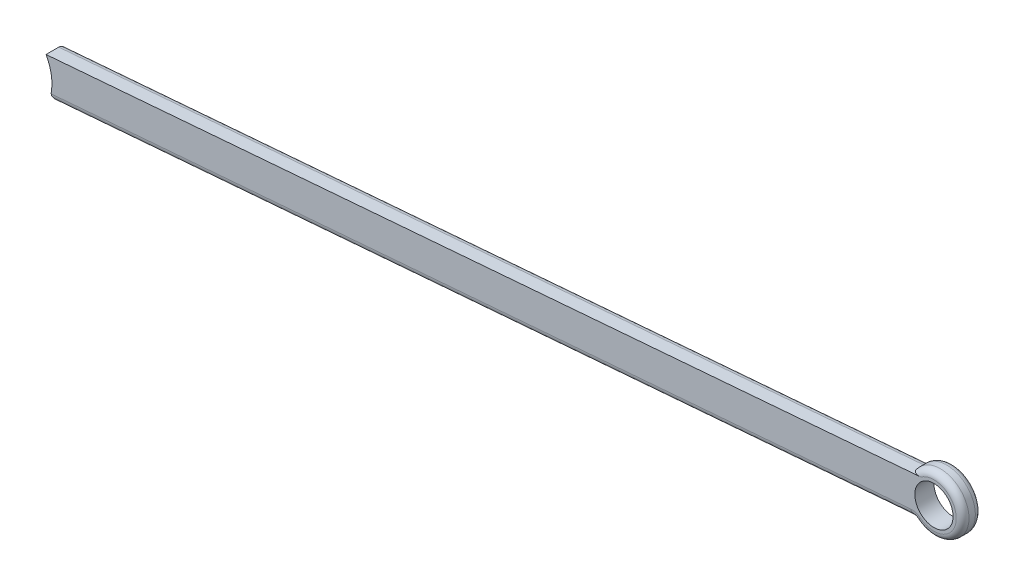
ISO-10303-21;
HEADER;
FILE_DESCRIPTION(('STEP AP214'),'2;1');
FILE_NAME('part.step','',(''),(''),'','','');
FILE_SCHEMA(('AUTOMOTIVE_DESIGN { 1 0 10303 214 1 1 1 1 }'));
ENDSEC;
DATA;
#1=APPLICATION_CONTEXT('core data for automotive mechanical design processes');
#2=APPLICATION_PROTOCOL_DEFINITION('international standard','automotive_design',2000,#1);
#3=PRODUCT_CONTEXT('',#1,'mechanical');
#4=PRODUCT('Part','Part','',(#3));
#5=PRODUCT_RELATED_PRODUCT_CATEGORY('part','',(#4));
#6=PRODUCT_DEFINITION_FORMATION('','',#4);
#7=PRODUCT_DEFINITION_CONTEXT('part definition',#1,'design');
#8=PRODUCT_DEFINITION('design','',#6,#7);
#9=PRODUCT_DEFINITION_SHAPE('','',#8);
#10=(LENGTH_UNIT() NAMED_UNIT(*) SI_UNIT(.MILLI.,.METRE.));
#11=(NAMED_UNIT(*) PLANE_ANGLE_UNIT() SI_UNIT($,.RADIAN.));
#12=(NAMED_UNIT(*) SI_UNIT($,.STERADIAN.) SOLID_ANGLE_UNIT());
#13=UNCERTAINTY_MEASURE_WITH_UNIT(LENGTH_MEASURE(1.E-05),#10,'distance_accuracy_value','');
#14=(GEOMETRIC_REPRESENTATION_CONTEXT(3) GLOBAL_UNCERTAINTY_ASSIGNED_CONTEXT((#13)) GLOBAL_UNIT_ASSIGNED_CONTEXT((#10,
#11,#12)) REPRESENTATION_CONTEXT('',''));
#15=CARTESIAN_POINT('',(0.,0.,0.));
#16=DIRECTION('',(0.,0.,1.));
#17=DIRECTION('',(1.,0.,0.));
#18=AXIS2_PLACEMENT_3D('',#15,#16,#17);
#19=CARTESIAN_POINT('',(-189.556946782326,289.010712035245,3.));
#20=DIRECTION('',(0.,0.,-1.));
#21=DIRECTION('',(-1.,0.,0.));
#22=AXIS2_PLACEMENT_3D('',#19,#20,#21);
#23=CYLINDRICAL_SURFACE('',#22,7.10165796602019);
#24=CARTESIAN_POINT('',(-189.556946782326,289.010712035245,0.));
#25=DIRECTION('',(0.,0.,1.));
#26=DIRECTION('',(1.,0.,0.));
#27=AXIS2_PLACEMENT_3D('',#24,#25,#26);
#28=CIRCLE('',#27,7.10165796602019);
#29=CARTESIAN_POINT('',(-182.555155592734,287.823923931293,0.));
#30=VERTEX_POINT('',#29);
#31=CARTESIAN_POINT('',(-182.928269618312,291.559081106163,0.));
#32=VERTEX_POINT('',#31);
#33=EDGE_CURVE('E161',#30,#32,#28,.T.);
#34=ORIENTED_EDGE('',*,*,#33,.F.);
#35=DIRECTION('',(0.,0.,-1.));
#36=VECTOR('',#35,1.);
#37=CARTESIAN_POINT('',(-182.555155592734,287.823923931293,3.));
#38=LINE('',#37,#36);
#39=CARTESIAN_POINT('',(-182.555155592734,287.823923931293,3.));
#40=VERTEX_POINT('',#39);
#41=EDGE_CURVE('E136',#30,#40,#38,.F.);
#42=ORIENTED_EDGE('',*,*,#41,.T.);
#43=CARTESIAN_POINT('',(-189.556946782326,289.010712035245,3.));
#44=DIRECTION('',(0.,0.,1.));
#45=DIRECTION('',(1.,0.,0.));
#46=AXIS2_PLACEMENT_3D('',#43,#44,#45);
#47=CIRCLE('',#46,7.10165796602019);
#48=CARTESIAN_POINT('',(-183.385792377944,292.525025507832,3.));
#49=VERTEX_POINT('',#48);
#50=EDGE_CURVE('E131',#40,#49,#47,.T.);
#51=ORIENTED_EDGE('',*,*,#50,.T.);
#52=DIRECTION('',(0.,0.,-1.));
#53=VECTOR('',#52,1.);
#54=CARTESIAN_POINT('',(-183.385792377944,292.525025507832,3.));
#55=LINE('',#54,#53);
#56=CARTESIAN_POINT('',(-183.385792377944,292.525025507832,1.));
#57=VERTEX_POINT('',#56);
#58=EDGE_CURVE('E133',#49,#57,#55,.T.);
#59=ORIENTED_EDGE('',*,*,#58,.T.);
#60=CARTESIAN_POINT('',(-183.385792377944,292.525025507832,1.));
#61=CARTESIAN_POINT('',(-183.385794028949,292.52502653467,0.973569993415327));
#62=CARTESIAN_POINT('',(-183.385219805159,292.524020252754,0.947153641670132));
#63=CARTESIAN_POINT('',(-183.382940389064,292.520013803654,0.894529591530214));
#64=CARTESIAN_POINT('',(-183.381235539787,292.517014241223,0.868321832289047));
#65=CARTESIAN_POINT('',(-183.374476282304,292.505092136045,0.790496460155402));
#66=CARTESIAN_POINT('',(-183.367776757817,292.493245730496,0.739432681463371));
#67=CARTESIAN_POINT('',(-183.35043714711,292.462247076764,0.640370539229717));
#68=CARTESIAN_POINT('',(-183.339799908946,292.443100108607,0.59236998947294));
#69=CARTESIAN_POINT('',(-183.315212155591,292.398181381844,0.500466484833437));
#70=CARTESIAN_POINT('',(-183.301259243782,292.372404830165,0.456566526041371));
#71=CARTESIAN_POINT('',(-183.27005627327,292.313696376092,0.371881328135714));
#72=CARTESIAN_POINT('',(-183.252684165942,292.280490098282,0.331331918391088));
#73=CARTESIAN_POINT('',(-183.215918643545,292.208607834344,0.256476831657969));
#74=CARTESIAN_POINT('',(-183.196524447942,292.169929734005,0.222173579843096));
#75=CARTESIAN_POINT('',(-183.154823655237,292.084601944724,0.157846625934326));
#76=CARTESIAN_POINT('',(-183.132409012621,292.037556685759,0.128416912817339));
#77=CARTESIAN_POINT('',(-183.087027032934,291.939297575497,0.078241912418041));
#78=CARTESIAN_POINT('',(-183.064059789306,291.888084425532,0.057495167643728));
#79=CARTESIAN_POINT('',(-183.021926134553,291.790891106229,0.0277172951011498));
#80=CARTESIAN_POINT('',(-183.002721255293,291.745326603864,0.0173704883515555));
#81=CARTESIAN_POINT('',(-182.964929692499,291.652944915322,0.00350741857914833));
#82=CARTESIAN_POINT('',(-182.946342763603,291.606128239982,-1.15880949627997E-05));
#83=CARTESIAN_POINT('',(-182.928269618312,291.559081106163,0.));
#84=B_SPLINE_CURVE_WITH_KNOTS('',3,(#60,#61,#62,#63,#64,#65,#66,#67,#68,#69,#70,#71,#72,#73,#74,
#75,#76,#77,#78,#79,#80,#81,#82,#83),.UNSPECIFIED.,.F.,.F.,(4,2,2,2,2,2,2,2,2,2,2,4),(0.,
0.0792380380932198,0.158452046602372,0.316157752677869,0.473749616100849,0.631455737561083,
0.796408841712736,0.961425855687792,1.1401801335986,1.31890439441004,1.46998723222719,
1.62100934703869),.UNSPECIFIED.);
#85=EDGE_CURVE('E215',#57,#32,#84,.T.);
#86=ORIENTED_EDGE('',*,*,#85,.T.);
#87=EDGE_LOOP('',(#34,#42,#51,#59,#86));
#88=FACE_BOUND('',#87,.T.);
#89=ADVANCED_FACE('F43',(#88),#23,.F.);
#90=CARTESIAN_POINT('',(-24.474724145225,299.491389117731,3.));
#91=DIRECTION('',(-0.0814494410892977,0.996677474685889,0.));
#92=DIRECTION('',(-0.996677474685889,-0.0814494410892977,0.));
#93=AXIS2_PLACEMENT_3D('',#90,#91,#92);
#94=PLANE('',#93);
#95=DIRECTION('',(0.996677474685889,0.0814494410892977,0.));
#96=VECTOR('',#95,1.);
#97=CARTESIAN_POINT('',(-182.897095731408,286.544960659717,2.));
#98=LINE('',#97,#96);
#99=CARTESIAN_POINT('',(-47.560062114542,297.60483311269,2.));
#100=VERTEX_POINT('',#99);
#101=CARTESIAN_POINT('',(-181.487768610989,286.660132226432,2.));
#102=VERTEX_POINT('',#101);
#103=EDGE_CURVE('E73',#100,#102,#98,.F.);
#104=ORIENTED_EDGE('',*,*,#103,.T.);
#105=DIRECTION('',(0.,0.,1.));
#106=VECTOR('',#105,1.);
#107=CARTESIAN_POINT('',(-181.487768610989,286.660132226432,0.));
#108=LINE('',#107,#106);
#109=CARTESIAN_POINT('',(-181.487768610989,286.660132226432,1.));
#110=VERTEX_POINT('',#109);
#111=EDGE_CURVE('E212',#102,#110,#108,.F.);
#112=ORIENTED_EDGE('',*,*,#111,.T.);
#113=DIRECTION('',(0.996677474685889,0.0814494410892977,0.));
#114=VECTOR('',#113,1.);
#115=CARTESIAN_POINT('',(-24.474724145225,299.491389117731,1.));
#116=LINE('',#115,#114);
#117=CARTESIAN_POINT('',(-47.560062114542,297.60483311269,1.));
#118=VERTEX_POINT('',#117);
#119=EDGE_CURVE('E204',#110,#118,#116,.T.);
#120=ORIENTED_EDGE('',*,*,#119,.T.);
#121=DIRECTION('',(0.,0.,1.));
#122=VECTOR('',#121,1.);
#123=CARTESIAN_POINT('',(-47.560062114542,297.60483311269,3.));
#124=LINE('',#123,#122);
#125=EDGE_CURVE('E207',#118,#100,#124,.T.);
#126=ORIENTED_EDGE('',*,*,#125,.T.);
#127=EDGE_LOOP('',(#104,#112,#120,#126));
#128=FACE_BOUND('',#127,.T.);
#129=ADVANCED_FACE('F228',(#128),#94,.F.);
#130=CARTESIAN_POINT('',(-44.0420354781863,300.90233043428,3.));
#131=DIRECTION('',(0.,0.,-1.));
#132=DIRECTION('',(-1.,0.,0.));
#133=AXIS2_PLACEMENT_3D('',#130,#131,#132);
#134=CYLINDRICAL_SURFACE('',#133,4.5);
#135=DIRECTION('',(0.,0.,-1.));
#136=VECTOR('',#135,1.);
#137=CARTESIAN_POINT('',(-47.6293416790148,303.61917312783,3.));
#138=LINE('',#137,#136);
#139=CARTESIAN_POINT('',(-47.6293416790148,303.61917312783,2.));
#140=VERTEX_POINT('',#139);
#141=CARTESIAN_POINT('',(-47.6293416790148,303.61917312783,1.));
#142=VERTEX_POINT('',#141);
#143=EDGE_CURVE('E147',#140,#142,#138,.T.);
#144=ORIENTED_EDGE('',*,*,#143,.F.);
#145=CARTESIAN_POINT('',(-44.0420354781863,300.90233043428,2.));
#146=DIRECTION('',(0.,0.,1.));
#147=DIRECTION('',(1.,0.,0.));
#148=AXIS2_PLACEMENT_3D('',#145,#146,#147);
#149=CIRCLE('',#148,4.5);
#150=CARTESIAN_POINT('',(-46.8537804561315,297.388914691872,2.));
#151=VERTEX_POINT('',#150);
#152=EDGE_CURVE('E185',#140,#151,#149,.F.);
#153=ORIENTED_EDGE('',*,*,#152,.T.);
#154=DIRECTION('',(0.,0.,-1.));
#155=VECTOR('',#154,1.);
#156=CARTESIAN_POINT('',(-46.8537804561315,297.388914691872,3.));
#157=LINE('',#156,#155);
#158=CARTESIAN_POINT('',(-46.8537804561315,297.388914691872,1.));
#159=VERTEX_POINT('',#158);
#160=EDGE_CURVE('E179',#151,#159,#157,.T.);
#161=ORIENTED_EDGE('',*,*,#160,.T.);
#162=CARTESIAN_POINT('',(-44.0420354781863,300.90233043428,1.));
#163=DIRECTION('',(0.,0.,1.));
#164=DIRECTION('',(1.,0.,0.));
#165=AXIS2_PLACEMENT_3D('',#162,#163,#164);
#166=CIRCLE('',#165,4.5);
#167=EDGE_CURVE('E182',#159,#142,#166,.T.);
#168=ORIENTED_EDGE('',*,*,#167,.T.);
#169=EDGE_LOOP('',(#144,#153,#161,#168));
#170=FACE_BOUND('',#169,.T.);
#171=ADVANCED_FACE('F233',(#170),#134,.T.);
#172=CARTESIAN_POINT('',(-44.0420354781863,300.90233043428,3.));
#173=DIRECTION('',(0.,0.,-1.));
#174=DIRECTION('',(-1.,0.,0.));
#175=AXIS2_PLACEMENT_3D('',#172,#173,#174);
#176=CYLINDRICAL_SURFACE('',#175,3.00000000000002);
#177=CARTESIAN_POINT('',(-44.0420354781863,300.90233043428,3.));
#178=DIRECTION('',(0.,0.,1.));
#179=DIRECTION('',(1.,0.,0.));
#180=AXIS2_PLACEMENT_3D('',#177,#178,#179);
#181=CIRCLE('',#180,3.00000000000002);
#182=CARTESIAN_POINT('',(-41.0420354781862,300.90233043428,3.));
#183=VERTEX_POINT('',#182);
#184=EDGE_CURVE('E142',#183,#183,#181,.T.);
#185=ORIENTED_EDGE('',*,*,#184,.T.);
#186=EDGE_LOOP('',(#185));
#187=FACE_BOUND('',#186,.T.);
#188=CARTESIAN_POINT('',(-44.0420354781863,300.90233043428,0.));
#189=DIRECTION('',(0.,0.,1.));
#190=DIRECTION('',(1.,0.,0.));
#191=AXIS2_PLACEMENT_3D('',#188,#189,#190);
#192=CIRCLE('',#191,3.00000000000002);
#193=CARTESIAN_POINT('',(-41.0420354781862,300.90233043428,0.));
#194=VERTEX_POINT('',#193);
#195=EDGE_CURVE('E157',#194,#194,#192,.T.);
#196=ORIENTED_EDGE('',*,*,#195,.F.);
#197=EDGE_LOOP('',(#196));
#198=FACE_BOUND('',#197,.T.);
#199=ADVANCED_FACE('F230',(#187,#198),#176,.F.);
#200=CARTESIAN_POINT('',(-24.9634207917557,305.471453965844,3.));
#201=DIRECTION('',(-0.0814494410892817,0.99667747468589,0.));
#202=DIRECTION('',(-0.996677474685891,-0.0814494410892817,0.));
#203=AXIS2_PLACEMENT_3D('',#200,#201,#202);
#204=PLANE('',#203);
#205=ORIENTED_EDGE('',*,*,#143,.T.);
#206=DIRECTION('',(0.996677474685891,0.0814494410892817,0.));
#207=VECTOR('',#206,1.);
#208=CARTESIAN_POINT('',(-183.385792377945,292.525025507832,1.));
#209=LINE('',#208,#207);
#210=EDGE_CURVE('E58',#142,#57,#209,.F.);
#211=ORIENTED_EDGE('',*,*,#210,.T.);
#212=ORIENTED_EDGE('',*,*,#58,.F.);
#213=DIRECTION('',(0.99667747468589,0.0814494410892817,0.));
#214=VECTOR('',#213,1.);
#215=CARTESIAN_POINT('',(-24.9634207917557,305.471453965844,3.));
#216=LINE('',#215,#214);
#217=CARTESIAN_POINT('',(-46.083169671494,303.745527790235,3.));
#218=VERTEX_POINT('',#217);
#219=EDGE_CURVE('E141',#49,#218,#216,.T.);
#220=ORIENTED_EDGE('',*,*,#219,.T.);
#221=CARTESIAN_POINT('',(-46.083169671494,303.745527790235,3.));
#222=CARTESIAN_POINT('',(-46.1449273123928,303.740480896469,2.99999278647898));
#223=CARTESIAN_POINT('',(-46.2067327721729,303.735430094897,2.99847030922505));
#224=CARTESIAN_POINT('',(-46.3303591491712,303.725327228557,2.99163798622466));
#225=CARTESIAN_POINT('',(-46.3921792628782,303.720275229453,2.9863140239824));
#226=CARTESIAN_POINT('',(-46.5162553660717,303.710135611057,2.97099141557773));
#227=CARTESIAN_POINT('',(-46.5785029631169,303.705048677603,2.96092069621473));
#228=CARTESIAN_POINT('',(-46.7017768646122,303.6949746159,2.93525696851751));
#229=CARTESIAN_POINT('',(-46.7628049685529,303.689987340595,2.91967284758988));
#230=CARTESIAN_POINT('',(-46.8900522401297,303.679588571271,2.87988161611204));
#231=CARTESIAN_POINT('',(-46.9560289183571,303.674196893719,2.85487116754592));
#232=CARTESIAN_POINT('',(-47.0835913091864,303.663772372546,2.79576662839545));
#233=CARTESIAN_POINT('',(-47.1451943304801,303.658738114443,2.76171120409791));
#234=CARTESIAN_POINT('',(-47.251497213139,303.650050940709,2.69046974039691));
#235=CARTESIAN_POINT('',(-47.2972616721873,303.646311025134,2.6548963353062));
#236=CARTESIAN_POINT('',(-47.3824788624418,303.639346994448,2.57672191963937));
#237=CARTESIAN_POINT('',(-47.4219348137824,303.636122616186,2.53412451711628));
#238=CARTESIAN_POINT('',(-47.4856107987889,303.630918953495,2.45104063027709));
#239=CARTESIAN_POINT('',(-47.5113013096655,303.628819500256,2.41169158069976));
#240=CARTESIAN_POINT('',(-47.55581969938,303.625181414664,2.32929895812212));
#241=CARTESIAN_POINT('',(-47.5746599677208,303.623641769829,2.28626223076905));
#242=CARTESIAN_POINT('',(-47.6025310557192,303.621364117732,2.20307341355973));
#243=CARTESIAN_POINT('',(-47.6124959957977,303.620549773252,2.16323678814989));
#244=CARTESIAN_POINT('',(-47.6259450842468,303.619450700819,2.08228835501476));
#245=CARTESIAN_POINT('',(-47.6293980184434,303.619168523718,2.04117136099152));
#246=CARTESIAN_POINT('',(-47.6293416790148,303.61917312783,2.));
#247=B_SPLINE_CURVE_WITH_KNOTS('',3,(#221,#222,#223,#224,#225,#226,#227,#228,#229,#230,#231,
#232,#233,#234,#235,#236,#237,#238,#239,#240,#241,#242,#243,#244,#245,#246),.UNSPECIFIED.,.F.,
.F.,(4,2,2,2,2,2,2,2,2,2,2,2,4),(0.,0.185944339614069,0.372582783121771,0.562151158963099,
0.75141533932056,0.963120760811125,1.17393533831202,1.34755258569102,1.5210809264484,
1.66162972471977,1.80192304372541,1.92461580338899,2.04789518942637),.UNSPECIFIED.);
#248=EDGE_CURVE('E11',#218,#140,#247,.T.);
#249=ORIENTED_EDGE('',*,*,#248,.T.);
#250=EDGE_LOOP('',(#205,#211,#212,#220,#249));
#251=FACE_BOUND('',#250,.T.);
#252=ADVANCED_FACE('F144',(#251),#204,.T.);
#253=CARTESIAN_POINT('',(0.,0.,3.));
#254=DIRECTION('',(0.,0.,1.));
#255=DIRECTION('',(1.,0.,0.));
#256=AXIS2_PLACEMENT_3D('',#253,#254,#255);
#257=PLANE('',#256);
#258=ORIENTED_EDGE('',*,*,#184,.F.);
#259=EDGE_LOOP('',(#258));
#260=FACE_BOUND('',#259,.T.);
#261=CARTESIAN_POINT('',(-44.0420354781863,300.90233043428,3.));
#262=DIRECTION('',(0.,0.,1.));
#263=DIRECTION('',(1.,0.,0.));
#264=AXIS2_PLACEMENT_3D('',#261,#262,#263);
#265=CIRCLE('',#264,3.5);
#266=CARTESIAN_POINT('',(-46.2289482388104,298.169673745741,3.));
#267=VERTEX_POINT('',#266);
#268=EDGE_CURVE('E152',#267,#218,#265,.T.);
#269=ORIENTED_EDGE('',*,*,#268,.T.);
#270=ORIENTED_EDGE('',*,*,#219,.F.);
#271=ORIENTED_EDGE('',*,*,#50,.F.);
#272=CARTESIAN_POINT('',(-181.569218052078,287.656809701118,3.));
#273=DIRECTION('',(0.,0.,1.));
#274=DIRECTION('',(1.,0.,0.));
#275=AXIS2_PLACEMENT_3D('',#272,#273,#274);
#276=CIRCLE('',#275,1.);
#277=CARTESIAN_POINT('',(-182.565895526764,287.575360260029,3.));
#278=VERTEX_POINT('',#277);
#279=EDGE_CURVE('E174',#40,#278,#276,.T.);
#280=ORIENTED_EDGE('',*,*,#279,.T.);
#281=DIRECTION('',(0.996677474685889,0.0814494410892977,0.));
#282=VECTOR('',#281,1.);
#283=CARTESIAN_POINT('',(-47.2220944735706,298.635785754403,3.));
#284=LINE('',#283,#282);
#285=CARTESIAN_POINT('',(-47.6415115556313,298.601510587375,3.));
#286=VERTEX_POINT('',#285);
#287=EDGE_CURVE('E171',#278,#286,#284,.T.);
#288=ORIENTED_EDGE('',*,*,#287,.T.);
#289=CARTESIAN_POINT('',(-47.4786126734527,296.608155638004,3.));
#290=DIRECTION('',(0.,0.,1.));
#291=DIRECTION('',(1.,0.,0.));
#292=AXIS2_PLACEMENT_3D('',#289,#290,#291);
#293=CIRCLE('',#292,2.);
#294=EDGE_CURVE('E167',#267,#286,#293,.T.);
#295=ORIENTED_EDGE('',*,*,#294,.F.);
#296=EDGE_LOOP('',(#269,#270,#271,#280,#288,#295));
#297=FACE_BOUND('',#296,.T.);
#298=ADVANCED_FACE('F150',(#260,#297),#257,.T.);
#299=CARTESIAN_POINT('',(0.,0.,0.));
#300=DIRECTION('',(0.,0.,1.));
#301=DIRECTION('',(1.,0.,0.));
#302=AXIS2_PLACEMENT_3D('',#299,#300,#301);
#303=PLANE('',#302);
#304=ORIENTED_EDGE('',*,*,#195,.T.);
#305=EDGE_LOOP('',(#304));
#306=FACE_BOUND('',#305,.T.);
#307=DIRECTION('',(0.996677474685889,0.0814494410892977,0.));
#308=VECTOR('',#307,1.);
#309=CARTESIAN_POINT('',(-24.5561735863143,300.488066592417,0.));
#310=LINE('',#309,#308);
#311=CARTESIAN_POINT('',(-47.6415115556313,298.601510587376,0.));
#312=VERTEX_POINT('',#311);
#313=CARTESIAN_POINT('',(-182.565895526764,287.575360260029,0.));
#314=VERTEX_POINT('',#313);
#315=EDGE_CURVE('E198',#312,#314,#310,.F.);
#316=ORIENTED_EDGE('',*,*,#315,.T.);
#317=CARTESIAN_POINT('',(-181.569218052078,287.656809701118,0.));
#318=DIRECTION('',(0.,0.,1.));
#319=DIRECTION('',(1.,0.,0.));
#320=AXIS2_PLACEMENT_3D('',#317,#318,#319);
#321=CIRCLE('',#320,1.);
#322=EDGE_CURVE('E201',#314,#30,#321,.F.);
#323=ORIENTED_EDGE('',*,*,#322,.T.);
#324=ORIENTED_EDGE('',*,*,#33,.T.);
#325=DIRECTION('',(0.996677474685891,0.0814494410892817,0.));
#326=VECTOR('',#325,1.);
#327=CARTESIAN_POINT('',(-47.5478922379256,302.622495653144,0.));
#328=LINE('',#327,#326);
#329=CARTESIAN_POINT('',(-47.067672456228,302.66173967522,0.));
#330=VERTEX_POINT('',#329);
#331=EDGE_CURVE('E188',#32,#330,#328,.T.);
#332=ORIENTED_EDGE('',*,*,#331,.T.);
#333=CARTESIAN_POINT('',(-44.0420354781863,300.90233043428,0.));
#334=DIRECTION('',(0.,0.,1.));
#335=DIRECTION('',(1.,0.,0.));
#336=AXIS2_PLACEMENT_3D('',#333,#334,#335);
#337=CIRCLE('',#336,3.5);
#338=CARTESIAN_POINT('',(-46.2289482388104,298.169673745741,0.));
#339=VERTEX_POINT('',#338);
#340=EDGE_CURVE('E191',#330,#339,#337,.F.);
#341=ORIENTED_EDGE('',*,*,#340,.T.);
#342=CARTESIAN_POINT('',(-47.4786126734527,296.608155638004,0.));
#343=DIRECTION('',(0.,0.,1.));
#344=DIRECTION('',(1.,0.,0.));
#345=AXIS2_PLACEMENT_3D('',#342,#343,#344);
#346=CIRCLE('',#345,2.);
#347=EDGE_CURVE('E194',#312,#339,#346,.F.);
#348=ORIENTED_EDGE('',*,*,#347,.F.);
#349=EDGE_LOOP('',(#316,#323,#324,#332,#341,#348));
#350=FACE_BOUND('',#349,.T.);
#351=ADVANCED_FACE('F253',(#306,#350),#303,.F.);
#352=CARTESIAN_POINT('',(-24.8819713506664,304.474776491159,1.));
#353=DIRECTION('',(-0.996677474685891,-0.0814494410892817,0.));
#354=DIRECTION('',(0.0814494410892817,-0.996677474685891,0.));
#355=AXIS2_PLACEMENT_3D('',#352,#353,#354);
#356=CYLINDRICAL_SURFACE('',#355,1.);
#357=ORIENTED_EDGE('',*,*,#85,.F.);
#358=ORIENTED_EDGE('',*,*,#210,.F.);
#359=CARTESIAN_POINT('',(-47.6293416790148,303.61917312783,1.));
#360=CARTESIAN_POINT('',(-47.6293418785584,303.619174085817,0.973690984905132));
#361=CARTESIAN_POINT('',(-47.6287939771065,303.618175425484,0.94739518986789));
#362=CARTESIAN_POINT('',(-47.6266102234385,303.614198945205,0.895004564383915));
#363=CARTESIAN_POINT('',(-47.6249745974669,303.611221536835,0.868909693286946));
#364=CARTESIAN_POINT('',(-47.6184644823445,303.599380351813,0.791366107169311));
#365=CARTESIAN_POINT('',(-47.6119866050528,303.587607269297,0.740458545465483));
#366=CARTESIAN_POINT('',(-47.5949764734668,303.556803045682,0.641663046184632));
#367=CARTESIAN_POINT('',(-47.5844454017447,303.537774021613,0.593774232587032));
#368=CARTESIAN_POINT('',(-47.5596637497617,303.493214198628,0.502152826212382));
#369=CARTESIAN_POINT('',(-47.5454116840188,303.467680803161,0.458421902866507));
#370=CARTESIAN_POINT('',(-47.5130881419254,303.410124913134,0.374752658797059));
#371=CARTESIAN_POINT('',(-47.4949079030315,303.377919017624,0.334983067917311));
#372=CARTESIAN_POINT('',(-47.4555236553714,303.308673816883,0.261645150064263));
#373=CARTESIAN_POINT('',(-47.4343188148407,303.271633182339,0.228078534755699));
#374=CARTESIAN_POINT('',(-47.3875515075016,303.190640116329,0.165151698384077));
#375=CARTESIAN_POINT('',(-47.3617744313501,303.146370107234,0.136360623747788));
#376=CARTESIAN_POINT('',(-47.3078887620441,303.054790029525,0.0869139036327363));
#377=CARTESIAN_POINT('',(-47.279778678259,303.007478021701,0.066263508686457));
#378=CARTESIAN_POINT('',(-47.2221906615107,302.9116550395,0.0334198829886402));
#379=CARTESIAN_POINT('',(-47.1927328740675,302.863164904249,0.0211293768558272));
#380=CARTESIAN_POINT('',(-47.1327313013915,302.765589639509,0.00459543830027205));
#381=CARTESIAN_POINT('',(-47.1021897401193,302.71650585089,0.000336399113860575));
#382=CARTESIAN_POINT('',(-47.0701553697945,302.665676321676,6.36962392175985E-06));
#383=CARTESIAN_POINT('',(-47.0689141071648,302.663707798738,-1.35553739064681E-08));
#384=CARTESIAN_POINT('',(-47.067672456228,302.66173967522,0.));
#385=B_SPLINE_CURVE_WITH_KNOTS('',3,(#359,#360,#361,#362,#363,#364,#365,#366,#367,#368,#369,
#370,#371,#372,#373,#374,#375,#376,#377,#378,#379,#380,#381,#382,#383,#384),.UNSPECIFIED.,.F.,
.F.,(4,2,2,2,2,2,2,2,2,2,2,2,4),(0.,0.07887644964679,0.157736498278993,0.314864929107363,
0.471947550383128,0.629092977767611,0.791328554360687,0.9536088320171,1.12917135093592,
1.30484691869946,1.478441662169,1.65169872695727,1.6586802821645),.UNSPECIFIED.);
#386=EDGE_CURVE('E48',#330,#142,#385,.F.);
#387=ORIENTED_EDGE('',*,*,#386,.F.);
#388=ORIENTED_EDGE('',*,*,#331,.F.);
#389=EDGE_LOOP('',(#357,#358,#387,#388));
#390=FACE_BOUND('',#389,.T.);
#391=ADVANCED_FACE('F45',(#390),#356,.T.);
#392=CARTESIAN_POINT('',(-44.0420354781863,300.90233043428,1.));
#393=DIRECTION('',(0.,0.,1.));
#394=DIRECTION('',(1.,0.,0.));
#395=AXIS2_PLACEMENT_3D('',#392,#393,#394);
#396=TOROIDAL_SURFACE('',#395,3.5,1.);
#397=ORIENTED_EDGE('',*,*,#386,.T.);
#398=ORIENTED_EDGE('',*,*,#167,.F.);
#399=CARTESIAN_POINT('',(-46.2289482388104,298.169673745741,1.));
#400=DIRECTION('',(-0.780759053868425,0.624832217321163,0.));
#401=DIRECTION('',(-0.624832217321163,-0.780759053868425,0.));
#402=AXIS2_PLACEMENT_3D('',#399,#400,#401);
#403=CIRCLE('',#402,1.);
#404=EDGE_CURVE('E291',#339,#159,#403,.T.);
#405=ORIENTED_EDGE('',*,*,#404,.F.);
#406=ORIENTED_EDGE('',*,*,#340,.F.);
#407=EDGE_LOOP('',(#397,#398,#405,#406));
#408=FACE_BOUND('',#407,.T.);
#409=ADVANCED_FACE('F302',(#408),#396,.T.);
#410=CARTESIAN_POINT('',(-24.5561735863143,300.488066592417,1.));
#411=DIRECTION('',(0.996677474685889,0.0814494410892977,0.));
#412=DIRECTION('',(-0.0814494410892977,0.996677474685889,0.));
#413=AXIS2_PLACEMENT_3D('',#410,#411,#412);
#414=CYLINDRICAL_SURFACE('',#413,1.);
#415=CARTESIAN_POINT('',(-181.569218052078,287.656809701118,1.));
#416=DIRECTION('',(0.704757401006276,0.0575934521180966,-0.707106781186547));
#417=DIRECTION('',(0.704757401006276,0.0575934521180966,0.707106781186547));
#418=AXIS2_PLACEMENT_3D('',#415,#416,#417);
#419=ELLIPSE('',#418,1.41421356237309,1.);
#420=EDGE_CURVE('E285',#314,#110,#419,.F.);
#421=ORIENTED_EDGE('',*,*,#420,.F.);
#422=ORIENTED_EDGE('',*,*,#315,.F.);
#423=CARTESIAN_POINT('',(-47.6415115556313,298.601510587375,1.));
#424=DIRECTION('',(0.996677474685889,0.0814494410892932,0.));
#425=DIRECTION('',(-0.0814494410892932,0.996677474685889,0.));
#426=AXIS2_PLACEMENT_3D('',#423,#424,#425);
#427=CIRCLE('',#426,1.);
#428=EDGE_CURVE('E288',#118,#312,#427,.T.);
#429=ORIENTED_EDGE('',*,*,#428,.F.);
#430=ORIENTED_EDGE('',*,*,#119,.F.);
#431=EDGE_LOOP('',(#421,#422,#429,#430));
#432=FACE_BOUND('',#431,.T.);
#433=ADVANCED_FACE('F335',(#432),#414,.T.);
#434=CARTESIAN_POINT('',(-47.4786126734527,296.608155638004,1.));
#435=DIRECTION('',(0.,0.,1.));
#436=DIRECTION('',(1.,0.,0.));
#437=AXIS2_PLACEMENT_3D('',#434,#435,#436);
#438=TOROIDAL_SURFACE('',#437,2.,1.);
#439=ORIENTED_EDGE('',*,*,#347,.T.);
#440=ORIENTED_EDGE('',*,*,#404,.T.);
#441=CARTESIAN_POINT('',(-47.4786126734527,296.608155638004,1.));
#442=DIRECTION('',(0.,0.,1.));
#443=DIRECTION('',(1.,0.,0.));
#444=AXIS2_PLACEMENT_3D('',#441,#442,#443);
#445=CIRCLE('',#444,1.);
#446=EDGE_CURVE('E281',#118,#159,#445,.F.);
#447=ORIENTED_EDGE('',*,*,#446,.F.);
#448=ORIENTED_EDGE('',*,*,#428,.T.);
#449=EDGE_LOOP('',(#439,#440,#447,#448));
#450=FACE_BOUND('',#449,.T.);
#451=ADVANCED_FACE('F332',(#450),#438,.T.);
#452=CARTESIAN_POINT('',(-181.569218052078,287.656809701118,3.));
#453=DIRECTION('',(0.,0.,-1.));
#454=DIRECTION('',(-1.,0.,0.));
#455=AXIS2_PLACEMENT_3D('',#452,#453,#454);
#456=CYLINDRICAL_SURFACE('',#455,1.);
#457=ORIENTED_EDGE('',*,*,#420,.T.);
#458=ORIENTED_EDGE('',*,*,#111,.F.);
#459=CARTESIAN_POINT('',(-181.569218052078,287.656809701118,2.));
#460=DIRECTION('',(-0.704757401006276,-0.0575934521180966,-0.707106781186547));
#461=DIRECTION('',(-0.704757401006276,-0.0575934521180966,0.707106781186547));
#462=AXIS2_PLACEMENT_3D('',#459,#460,#461);
#463=ELLIPSE('',#462,1.41421356237309,1.);
#464=EDGE_CURVE('E275',#278,#102,#463,.F.);
#465=ORIENTED_EDGE('',*,*,#464,.F.);
#466=ORIENTED_EDGE('',*,*,#279,.F.);
#467=ORIENTED_EDGE('',*,*,#41,.F.);
#468=ORIENTED_EDGE('',*,*,#322,.F.);
#469=EDGE_LOOP('',(#457,#458,#465,#466,#467,#468));
#470=FACE_BOUND('',#469,.T.);
#471=ADVANCED_FACE('F312',(#470),#456,.T.);
#472=CARTESIAN_POINT('',(-47.4786126734527,296.608155638004,3.));
#473=DIRECTION('',(0.,0.,-1.));
#474=DIRECTION('',(-1.,0.,0.));
#475=AXIS2_PLACEMENT_3D('',#472,#473,#474);
#476=CYLINDRICAL_SURFACE('',#475,1.);
#477=ORIENTED_EDGE('',*,*,#446,.T.);
#478=ORIENTED_EDGE('',*,*,#160,.F.);
#479=CARTESIAN_POINT('',(-47.4786126734527,296.608155638004,2.));
#480=DIRECTION('',(0.,0.,1.));
#481=DIRECTION('',(1.,0.,0.));
#482=AXIS2_PLACEMENT_3D('',#479,#480,#481);
#483=CIRCLE('',#482,1.);
#484=EDGE_CURVE('E272',#100,#151,#483,.F.);
#485=ORIENTED_EDGE('',*,*,#484,.F.);
#486=ORIENTED_EDGE('',*,*,#125,.F.);
#487=EDGE_LOOP('',(#477,#478,#485,#486));
#488=FACE_BOUND('',#487,.T.);
#489=ADVANCED_FACE('F323',(#488),#476,.F.);
#490=CARTESIAN_POINT('',(-24.5561735863143,300.488066592417,2.));
#491=DIRECTION('',(-0.996677474685889,-0.0814494410892977,0.));
#492=DIRECTION('',(0.0814494410892977,-0.996677474685889,0.));
#493=AXIS2_PLACEMENT_3D('',#490,#491,#492);
#494=CYLINDRICAL_SURFACE('',#493,1.);
#495=ORIENTED_EDGE('',*,*,#464,.T.);
#496=ORIENTED_EDGE('',*,*,#103,.F.);
#497=CARTESIAN_POINT('',(-47.6415115556313,298.601510587375,2.));
#498=DIRECTION('',(0.996677474685889,0.0814494410892932,0.));
#499=DIRECTION('',(-0.0814494410892932,0.996677474685889,0.));
#500=AXIS2_PLACEMENT_3D('',#497,#498,#499);
#501=CIRCLE('',#500,1.);
#502=EDGE_CURVE('E269',#286,#100,#501,.T.);
#503=ORIENTED_EDGE('',*,*,#502,.F.);
#504=ORIENTED_EDGE('',*,*,#287,.F.);
#505=EDGE_LOOP('',(#495,#496,#503,#504));
#506=FACE_BOUND('',#505,.T.);
#507=ADVANCED_FACE('F317',(#506),#494,.T.);
#508=CARTESIAN_POINT('',(-47.4786126734527,296.608155638004,2.));
#509=DIRECTION('',(0.,0.,1.));
#510=DIRECTION('',(1.,0.,0.));
#511=AXIS2_PLACEMENT_3D('',#508,#509,#510);
#512=TOROIDAL_SURFACE('',#511,2.,1.);
#513=ORIENTED_EDGE('',*,*,#502,.T.);
#514=ORIENTED_EDGE('',*,*,#484,.T.);
#515=CARTESIAN_POINT('',(-46.2289482388104,298.169673745741,2.));
#516=DIRECTION('',(-0.780759053868422,0.624832217321168,0.));
#517=DIRECTION('',(-0.624832217321168,-0.780759053868422,0.));
#518=AXIS2_PLACEMENT_3D('',#515,#516,#517);
#519=CIRCLE('',#518,1.);
#520=EDGE_CURVE('E248',#267,#151,#519,.F.);
#521=ORIENTED_EDGE('',*,*,#520,.F.);
#522=ORIENTED_EDGE('',*,*,#294,.T.);
#523=EDGE_LOOP('',(#513,#514,#521,#522));
#524=FACE_BOUND('',#523,.T.);
#525=ADVANCED_FACE('F239',(#524),#512,.T.);
#526=CARTESIAN_POINT('',(-44.0420354781863,300.90233043428,2.));
#527=DIRECTION('',(0.,0.,1.));
#528=DIRECTION('',(1.,0.,0.));
#529=AXIS2_PLACEMENT_3D('',#526,#527,#528);
#530=TOROIDAL_SURFACE('',#529,3.5,1.);
#531=ORIENTED_EDGE('',*,*,#520,.T.);
#532=ORIENTED_EDGE('',*,*,#152,.F.);
#533=ORIENTED_EDGE('',*,*,#248,.F.);
#534=ORIENTED_EDGE('',*,*,#268,.F.);
#535=EDGE_LOOP('',(#531,#532,#533,#534));
#536=FACE_BOUND('',#535,.T.);
#537=ADVANCED_FACE('F235',(#536),#530,.T.);
#538=CLOSED_SHELL('',(#89,#129,#171,#199,#252,#298,#351,#391,#409,#433,#451,#471,#489,#507,#525,#537));
#539=MANIFOLD_SOLID_BREP('B2',#538);
#540=ADVANCED_BREP_SHAPE_REPRESENTATION('',(#18,#539),#14);
#541=SHAPE_DEFINITION_REPRESENTATION(#9,#540);
ENDSEC;
END-ISO-10303-21;
